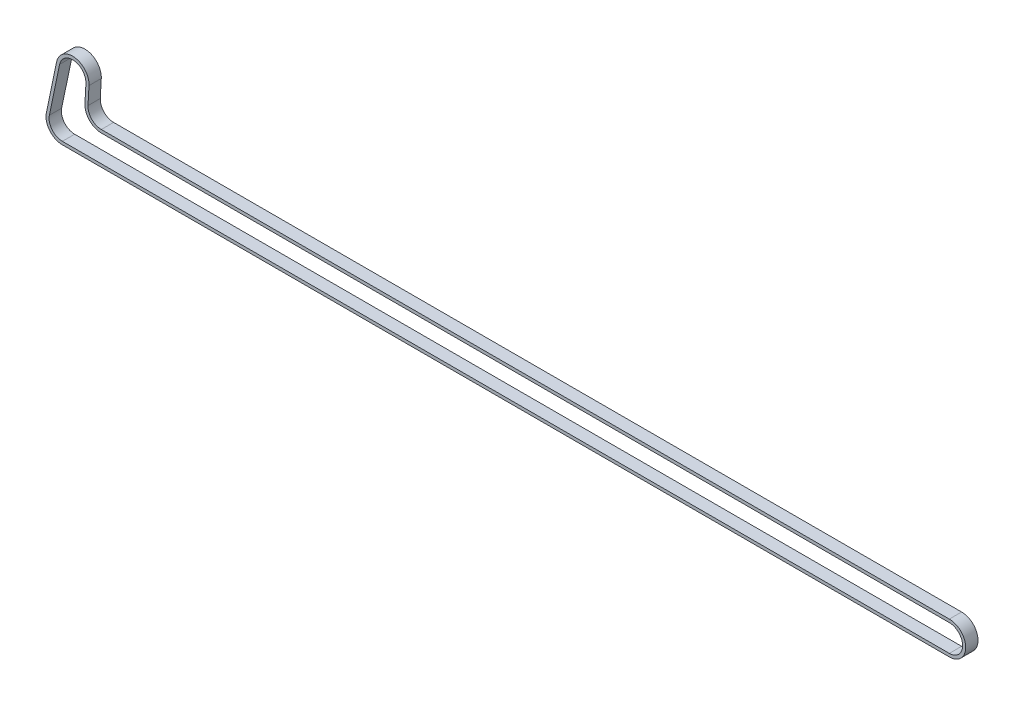
ISO-10303-21;
HEADER;
FILE_DESCRIPTION(('STEP AP214'),'2;1');
FILE_NAME('part.step','',(''),(''),'','','');
FILE_SCHEMA(('AUTOMOTIVE_DESIGN { 1 0 10303 214 1 1 1 1 }'));
ENDSEC;
DATA;
#1=APPLICATION_CONTEXT('core data for automotive mechanical design processes');
#2=APPLICATION_PROTOCOL_DEFINITION('international standard','automotive_design',2000,#1);
#3=PRODUCT_CONTEXT('',#1,'mechanical');
#4=PRODUCT('Part','Part','',(#3));
#5=PRODUCT_RELATED_PRODUCT_CATEGORY('part','',(#4));
#6=PRODUCT_DEFINITION_FORMATION('','',#4);
#7=PRODUCT_DEFINITION_CONTEXT('part definition',#1,'design');
#8=PRODUCT_DEFINITION('design','',#6,#7);
#9=PRODUCT_DEFINITION_SHAPE('','',#8);
#10=(LENGTH_UNIT() NAMED_UNIT(*) SI_UNIT(.MILLI.,.METRE.));
#11=(NAMED_UNIT(*) PLANE_ANGLE_UNIT() SI_UNIT($,.RADIAN.));
#12=(NAMED_UNIT(*) SI_UNIT($,.STERADIAN.) SOLID_ANGLE_UNIT());
#13=UNCERTAINTY_MEASURE_WITH_UNIT(LENGTH_MEASURE(1.E-05),#10,'distance_accuracy_value','');
#14=(GEOMETRIC_REPRESENTATION_CONTEXT(3) GLOBAL_UNCERTAINTY_ASSIGNED_CONTEXT((#13)) GLOBAL_UNIT_ASSIGNED_CONTEXT((#10,
#11,#12)) REPRESENTATION_CONTEXT('',''));
#15=CARTESIAN_POINT('',(0.,0.,0.));
#16=DIRECTION('',(0.,0.,1.));
#17=DIRECTION('',(1.,0.,0.));
#18=AXIS2_PLACEMENT_3D('',#15,#16,#17);
#19=CARTESIAN_POINT('',(-197.5,21.5000000000002,3.));
#20=DIRECTION('',(0.,0.,-1.));
#21=DIRECTION('',(-1.,0.,0.));
#22=AXIS2_PLACEMENT_3D('',#19,#20,#21);
#23=PLANE('',#22);
#24=CARTESIAN_POINT('',(-197.5,21.5000000000002,3.));
#25=DIRECTION('',(0.,0.,-1.));
#26=DIRECTION('',(-1.,0.,0.));
#27=AXIS2_PLACEMENT_3D('',#24,#25,#26);
#28=CIRCLE('',#27,6.50000000000003);
#29=CARTESIAN_POINT('',(-197.5,15.0000000000002,3.));
#30=VERTEX_POINT('',#29);
#31=CARTESIAN_POINT('',(-203.990214915379,21.8565253878626,3.));
#32=VERTEX_POINT('',#31);
#33=EDGE_CURVE('E261',#30,#32,#28,.T.);
#34=ORIENTED_EDGE('',*,*,#33,.T.);
#35=DIRECTION('',(0.0548500596711289,0.998494602366019,0.));
#36=VECTOR('',#35,1.);
#37=CARTESIAN_POINT('',(-203.990214915379,21.8565253878626,3.));
#38=LINE('',#37,#36);
#39=CARTESIAN_POINT('',(-203.512043181072,30.5611995226312,3.));
#40=VERTEX_POINT('',#39);
#41=EDGE_CURVE('E264',#32,#40,#38,.T.);
#42=ORIENTED_EDGE('',*,*,#41,.T.);
#43=CARTESIAN_POINT('',(-211.5,31.0000000000002,3.));
#44=DIRECTION('',(0.,0.,-1.));
#45=DIRECTION('',(-1.,0.,0.));
#46=AXIS2_PLACEMENT_3D('',#43,#44,#45);
#47=CIRCLE('',#46,8.);
#48=CARTESIAN_POINT('',(-219.331843357901,32.6316340328962,3.));
#49=VERTEX_POINT('',#48);
#50=EDGE_CURVE('E267',#40,#49,#47,.F.);
#51=ORIENTED_EDGE('',*,*,#50,.T.);
#52=DIRECTION('',(-0.203954254112001,-0.978980419737605,0.));
#53=VECTOR('',#52,1.);
#54=CARTESIAN_POINT('',(-220.646319231445,26.3221498398846,3.));
#55=LINE('',#54,#53);
#56=CARTESIAN_POINT('',(-224.331843357901,8.6316340328962,3.));
#57=VERTEX_POINT('',#56);
#58=EDGE_CURVE('E269',#49,#57,#55,.T.);
#59=ORIENTED_EDGE('',*,*,#58,.T.);
#60=CARTESIAN_POINT('',(-216.5,7.0000000000002,3.));
#61=DIRECTION('',(0.,0.,-1.));
#62=DIRECTION('',(-1.,0.,0.));
#63=AXIS2_PLACEMENT_3D('',#60,#61,#62);
#64=CIRCLE('',#63,8.0000000000001);
#65=CARTESIAN_POINT('',(-216.5,-0.999999999999898,3.));
#66=VERTEX_POINT('',#65);
#67=EDGE_CURVE('E271',#57,#66,#64,.F.);
#68=ORIENTED_EDGE('',*,*,#67,.T.);
#69=DIRECTION('',(1.,0.,0.));
#70=VECTOR('',#69,1.);
#71=CARTESIAN_POINT('',(-197.5,-1.,3.));
#72=LINE('',#71,#70);
#73=CARTESIAN_POINT('',(216.5,-1.,3.));
#74=VERTEX_POINT('',#73);
#75=EDGE_CURVE('E273',#66,#74,#72,.T.);
#76=ORIENTED_EDGE('',*,*,#75,.T.);
#77=CARTESIAN_POINT('',(216.5,7.0000000000002,3.));
#78=DIRECTION('',(0.,0.,-1.));
#79=DIRECTION('',(-1.,0.,0.));
#80=AXIS2_PLACEMENT_3D('',#77,#78,#79);
#81=CIRCLE('',#80,8.0000000000001);
#82=CARTESIAN_POINT('',(216.5,15.0000000000003,3.));
#83=VERTEX_POINT('',#82);
#84=EDGE_CURVE('E275',#74,#83,#81,.F.);
#85=ORIENTED_EDGE('',*,*,#84,.T.);
#86=DIRECTION('',(-1.,0.,0.));
#87=VECTOR('',#86,1.);
#88=CARTESIAN_POINT('',(-197.5,15.0000000000002,3.));
#89=LINE('',#88,#87);
#90=EDGE_CURVE('E277',#83,#30,#89,.T.);
#91=ORIENTED_EDGE('',*,*,#90,.T.);
#92=EDGE_LOOP('',(#34,#42,#51,#59,#68,#76,#85,#91));
#93=FACE_BOUND('',#92,.T.);
#94=CARTESIAN_POINT('',(-197.5,21.5000000000002,3.));
#95=DIRECTION('',(0.,0.,-1.));
#96=DIRECTION('',(-1.,0.,0.));
#97=AXIS2_PLACEMENT_3D('',#94,#95,#96);
#98=CIRCLE('',#97,8.00000000000004);
#99=CARTESIAN_POINT('',(-197.5,13.5000000000001,3.));
#100=VERTEX_POINT('',#99);
#101=CARTESIAN_POINT('',(-205.487956818928,21.9388004773693,3.));
#102=VERTEX_POINT('',#101);
#103=EDGE_CURVE('E196',#100,#102,#98,.T.);
#104=ORIENTED_EDGE('',*,*,#103,.F.);
#105=DIRECTION('',(-1.,0.,0.));
#106=VECTOR('',#105,1.);
#107=CARTESIAN_POINT('',(-197.5,13.5000000000001,3.));
#108=LINE('',#107,#106);
#109=CARTESIAN_POINT('',(216.5,13.5000000000002,3.));
#110=VERTEX_POINT('',#109);
#111=EDGE_CURVE('E229',#110,#100,#108,.T.);
#112=ORIENTED_EDGE('',*,*,#111,.F.);
#113=CARTESIAN_POINT('',(216.5,7.0000000000002,3.));
#114=DIRECTION('',(0.,0.,-1.));
#115=DIRECTION('',(-1.,0.,0.));
#116=AXIS2_PLACEMENT_3D('',#113,#114,#115);
#117=CIRCLE('',#116,6.5000000000001);
#118=CARTESIAN_POINT('',(216.5,0.5,3.));
#119=VERTEX_POINT('',#118);
#120=EDGE_CURVE('E227',#119,#110,#117,.F.);
#121=ORIENTED_EDGE('',*,*,#120,.F.);
#122=DIRECTION('',(1.,0.,0.));
#123=VECTOR('',#122,1.);
#124=CARTESIAN_POINT('',(-197.5,0.5,3.));
#125=LINE('',#124,#123);
#126=CARTESIAN_POINT('',(-216.5,0.500000000000104,3.));
#127=VERTEX_POINT('',#126);
#128=EDGE_CURVE('E225',#127,#119,#125,.T.);
#129=ORIENTED_EDGE('',*,*,#128,.F.);
#130=CARTESIAN_POINT('',(-216.5,7.0000000000002,3.));
#131=DIRECTION('',(0.,0.,-1.));
#132=DIRECTION('',(-1.,0.,0.));
#133=AXIS2_PLACEMENT_3D('',#130,#131,#132);
#134=CIRCLE('',#133,6.5000000000001);
#135=CARTESIAN_POINT('',(-222.863372728294,8.3257026517282,3.));
#136=VERTEX_POINT('',#135);
#137=EDGE_CURVE('E223',#136,#127,#134,.F.);
#138=ORIENTED_EDGE('',*,*,#137,.F.);
#139=DIRECTION('',(-0.203954254112001,-0.978980419737605,0.));
#140=VECTOR('',#139,1.);
#141=CARTESIAN_POINT('',(-219.177848601838,26.0162184587166,3.));
#142=LINE('',#141,#140);
#143=CARTESIAN_POINT('',(-217.863372728294,32.3257026517282,3.));
#144=VERTEX_POINT('',#143);
#145=EDGE_CURVE('E219',#144,#136,#142,.T.);
#146=ORIENTED_EDGE('',*,*,#145,.F.);
#147=CARTESIAN_POINT('',(-211.5,31.0000000000002,3.));
#148=DIRECTION('',(0.,0.,-1.));
#149=DIRECTION('',(-1.,0.,0.));
#150=AXIS2_PLACEMENT_3D('',#147,#148,#149);
#151=CIRCLE('',#150,6.5);
#152=CARTESIAN_POINT('',(-205.009785084621,30.6434746121379,3.));
#153=VERTEX_POINT('',#152);
#154=EDGE_CURVE('E217',#153,#144,#151,.F.);
#155=ORIENTED_EDGE('',*,*,#154,.F.);
#156=DIRECTION('',(0.0548500596711289,0.998494602366019,0.));
#157=VECTOR('',#156,1.);
#158=CARTESIAN_POINT('',(-205.487956818928,21.9388004773693,3.));
#159=LINE('',#158,#157);
#160=EDGE_CURVE('E204',#102,#153,#159,.T.);
#161=ORIENTED_EDGE('',*,*,#160,.F.);
#162=EDGE_LOOP('',(#104,#112,#121,#129,#138,#146,#155,#161));
#163=FACE_BOUND('',#162,.T.);
#164=ADVANCED_FACE('F83',(#93,#163),#23,.F.);
#165=CARTESIAN_POINT('',(-197.5,21.5000000000002,-3.));
#166=DIRECTION('',(0.,0.,-1.));
#167=DIRECTION('',(-1.,0.,0.));
#168=AXIS2_PLACEMENT_3D('',#165,#166,#167);
#169=PLANE('',#168);
#170=CARTESIAN_POINT('',(-197.5,21.5000000000002,-3.));
#171=DIRECTION('',(0.,0.,-1.));
#172=DIRECTION('',(-1.,0.,0.));
#173=AXIS2_PLACEMENT_3D('',#170,#171,#172);
#174=CIRCLE('',#173,6.50000000000003);
#175=CARTESIAN_POINT('',(-197.5,15.0000000000002,-3.));
#176=VERTEX_POINT('',#175);
#177=CARTESIAN_POINT('',(-203.990214915379,21.8565253878626,-3.));
#178=VERTEX_POINT('',#177);
#179=EDGE_CURVE('E212',#176,#178,#174,.T.);
#180=ORIENTED_EDGE('',*,*,#179,.F.);
#181=DIRECTION('',(-1.,0.,0.));
#182=VECTOR('',#181,1.);
#183=CARTESIAN_POINT('',(-197.5,15.0000000000002,-3.));
#184=LINE('',#183,#182);
#185=CARTESIAN_POINT('',(216.5,15.0000000000003,-3.));
#186=VERTEX_POINT('',#185);
#187=EDGE_CURVE('E265',#186,#176,#184,.T.);
#188=ORIENTED_EDGE('',*,*,#187,.F.);
#189=CARTESIAN_POINT('',(216.5,7.0000000000002,-3.));
#190=DIRECTION('',(0.,0.,-1.));
#191=DIRECTION('',(-1.,0.,0.));
#192=AXIS2_PLACEMENT_3D('',#189,#190,#191);
#193=CIRCLE('',#192,8.0000000000001);
#194=CARTESIAN_POINT('',(216.5,-1.,-3.));
#195=VERTEX_POINT('',#194);
#196=EDGE_CURVE('E292',#195,#186,#193,.F.);
#197=ORIENTED_EDGE('',*,*,#196,.F.);
#198=DIRECTION('',(1.,0.,0.));
#199=VECTOR('',#198,1.);
#200=CARTESIAN_POINT('',(-197.5,-1.,-3.));
#201=LINE('',#200,#199);
#202=CARTESIAN_POINT('',(-216.5,-0.999999999999898,-3.));
#203=VERTEX_POINT('',#202);
#204=EDGE_CURVE('E290',#203,#195,#201,.T.);
#205=ORIENTED_EDGE('',*,*,#204,.F.);
#206=CARTESIAN_POINT('',(-216.5,7.0000000000002,-3.));
#207=DIRECTION('',(0.,0.,-1.));
#208=DIRECTION('',(-1.,0.,0.));
#209=AXIS2_PLACEMENT_3D('',#206,#207,#208);
#210=CIRCLE('',#209,8.0000000000001);
#211=CARTESIAN_POINT('',(-224.331843357901,8.6316340328962,-3.));
#212=VERTEX_POINT('',#211);
#213=EDGE_CURVE('E288',#212,#203,#210,.F.);
#214=ORIENTED_EDGE('',*,*,#213,.F.);
#215=DIRECTION('',(-0.203954254112001,-0.978980419737605,0.));
#216=VECTOR('',#215,1.);
#217=CARTESIAN_POINT('',(-220.646319231445,26.3221498398846,-3.));
#218=LINE('',#217,#216);
#219=CARTESIAN_POINT('',(-219.331843357901,32.6316340328962,-3.));
#220=VERTEX_POINT('',#219);
#221=EDGE_CURVE('E286',#220,#212,#218,.T.);
#222=ORIENTED_EDGE('',*,*,#221,.F.);
#223=CARTESIAN_POINT('',(-211.5,31.0000000000002,-3.));
#224=DIRECTION('',(0.,0.,-1.));
#225=DIRECTION('',(-1.,0.,0.));
#226=AXIS2_PLACEMENT_3D('',#223,#224,#225);
#227=CIRCLE('',#226,8.);
#228=CARTESIAN_POINT('',(-203.512043181072,30.5611995226312,-3.));
#229=VERTEX_POINT('',#228);
#230=EDGE_CURVE('E284',#229,#220,#227,.F.);
#231=ORIENTED_EDGE('',*,*,#230,.F.);
#232=DIRECTION('',(0.0548500596711289,0.998494602366019,0.));
#233=VECTOR('',#232,1.);
#234=CARTESIAN_POINT('',(-203.990214915379,21.8565253878626,-3.));
#235=LINE('',#234,#233);
#236=EDGE_CURVE('E282',#178,#229,#235,.T.);
#237=ORIENTED_EDGE('',*,*,#236,.F.);
#238=EDGE_LOOP('',(#180,#188,#197,#205,#214,#222,#231,#237));
#239=FACE_BOUND('',#238,.T.);
#240=DIRECTION('',(-1.,0.,0.));
#241=VECTOR('',#240,1.);
#242=CARTESIAN_POINT('',(-197.5,13.5000000000001,-3.));
#243=LINE('',#242,#241);
#244=CARTESIAN_POINT('',(216.5,13.5000000000003,-3.));
#245=VERTEX_POINT('',#244);
#246=CARTESIAN_POINT('',(-197.5,13.5000000000001,-3.));
#247=VERTEX_POINT('',#246);
#248=EDGE_CURVE('E205',#245,#247,#243,.T.);
#249=ORIENTED_EDGE('',*,*,#248,.T.);
#250=CARTESIAN_POINT('',(-197.5,21.5000000000002,-3.));
#251=DIRECTION('',(0.,0.,-1.));
#252=DIRECTION('',(-1.,0.,0.));
#253=AXIS2_PLACEMENT_3D('',#250,#251,#252);
#254=CIRCLE('',#253,8.00000000000004);
#255=CARTESIAN_POINT('',(-205.487956818928,21.9388004773693,-3.));
#256=VERTEX_POINT('',#255);
#257=EDGE_CURVE('E106',#247,#256,#254,.T.);
#258=ORIENTED_EDGE('',*,*,#257,.T.);
#259=DIRECTION('',(0.0548500596711289,0.998494602366019,0.));
#260=VECTOR('',#259,1.);
#261=CARTESIAN_POINT('',(-205.487956818928,21.9388004773693,-3.));
#262=LINE('',#261,#260);
#263=CARTESIAN_POINT('',(-205.009785084621,30.6434746121379,-3.));
#264=VERTEX_POINT('',#263);
#265=EDGE_CURVE('E211',#256,#264,#262,.T.);
#266=ORIENTED_EDGE('',*,*,#265,.T.);
#267=CARTESIAN_POINT('',(-211.5,31.0000000000002,-3.));
#268=DIRECTION('',(0.,0.,-1.));
#269=DIRECTION('',(-1.,0.,0.));
#270=AXIS2_PLACEMENT_3D('',#267,#268,#269);
#271=CIRCLE('',#270,6.5);
#272=CARTESIAN_POINT('',(-217.863372728294,32.3257026517282,-3.));
#273=VERTEX_POINT('',#272);
#274=EDGE_CURVE('E233',#264,#273,#271,.F.);
#275=ORIENTED_EDGE('',*,*,#274,.T.);
#276=DIRECTION('',(-0.203954254112001,-0.978980419737605,0.));
#277=VECTOR('',#276,1.);
#278=CARTESIAN_POINT('',(-219.177848601838,26.0162184587166,-3.));
#279=LINE('',#278,#277);
#280=CARTESIAN_POINT('',(-222.863372728294,8.3257026517282,-3.));
#281=VERTEX_POINT('',#280);
#282=EDGE_CURVE('E236',#273,#281,#279,.T.);
#283=ORIENTED_EDGE('',*,*,#282,.T.);
#284=CARTESIAN_POINT('',(-216.5,7.0000000000002,-3.));
#285=DIRECTION('',(0.,0.,-1.));
#286=DIRECTION('',(-1.,0.,0.));
#287=AXIS2_PLACEMENT_3D('',#284,#285,#286);
#288=CIRCLE('',#287,6.5000000000001);
#289=CARTESIAN_POINT('',(-216.5,0.500000000000104,-3.));
#290=VERTEX_POINT('',#289);
#291=EDGE_CURVE('E239',#281,#290,#288,.F.);
#292=ORIENTED_EDGE('',*,*,#291,.T.);
#293=DIRECTION('',(1.,0.,0.));
#294=VECTOR('',#293,1.);
#295=CARTESIAN_POINT('',(-197.5,0.5,-3.));
#296=LINE('',#295,#294);
#297=CARTESIAN_POINT('',(216.5,0.5,-3.));
#298=VERTEX_POINT('',#297);
#299=EDGE_CURVE('E242',#290,#298,#296,.T.);
#300=ORIENTED_EDGE('',*,*,#299,.T.);
#301=CARTESIAN_POINT('',(216.5,7.0000000000002,-3.));
#302=DIRECTION('',(0.,0.,-1.));
#303=DIRECTION('',(-1.,0.,0.));
#304=AXIS2_PLACEMENT_3D('',#301,#302,#303);
#305=CIRCLE('',#304,6.5000000000001);
#306=EDGE_CURVE('E245',#298,#245,#305,.F.);
#307=ORIENTED_EDGE('',*,*,#306,.T.);
#308=EDGE_LOOP('',(#249,#258,#266,#275,#283,#292,#300,#307));
#309=FACE_BOUND('',#308,.T.);
#310=ADVANCED_FACE('F322',(#239,#309),#169,.T.);
#311=CARTESIAN_POINT('',(-197.5,21.5000000000002,3.));
#312=DIRECTION('',(0.,0.,-1.));
#313=DIRECTION('',(-1.,0.,0.));
#314=AXIS2_PLACEMENT_3D('',#311,#312,#313);
#315=CYLINDRICAL_SURFACE('',#314,6.50000000000003);
#316=ORIENTED_EDGE('',*,*,#179,.T.);
#317=DIRECTION('',(0.,0.,-1.));
#318=VECTOR('',#317,1.);
#319=CARTESIAN_POINT('',(-203.990214915379,21.8565253878626,3.));
#320=LINE('',#319,#318);
#321=EDGE_CURVE('E12',#32,#178,#320,.T.);
#322=ORIENTED_EDGE('',*,*,#321,.F.);
#323=ORIENTED_EDGE('',*,*,#33,.F.);
#324=DIRECTION('',(0.,0.,-1.));
#325=VECTOR('',#324,1.);
#326=CARTESIAN_POINT('',(-197.5,15.0000000000002,3.));
#327=LINE('',#326,#325);
#328=EDGE_CURVE('E279',#30,#176,#327,.T.);
#329=ORIENTED_EDGE('',*,*,#328,.T.);
#330=EDGE_LOOP('',(#316,#322,#323,#329));
#331=FACE_BOUND('',#330,.T.);
#332=ADVANCED_FACE('F85',(#331),#315,.F.);
#333=CARTESIAN_POINT('',(-203.990214915379,21.8565253878626,3.));
#334=DIRECTION('',(-0.998494602366019,0.0548500596711289,0.));
#335=DIRECTION('',(-0.0548500596711289,-0.998494602366019,0.));
#336=AXIS2_PLACEMENT_3D('',#333,#334,#335);
#337=PLANE('',#336);
#338=ORIENTED_EDGE('',*,*,#236,.T.);
#339=DIRECTION('',(0.,0.,-1.));
#340=VECTOR('',#339,1.);
#341=CARTESIAN_POINT('',(-203.512043181072,30.5611995226312,3.));
#342=LINE('',#341,#340);
#343=EDGE_CURVE('E91',#40,#229,#342,.T.);
#344=ORIENTED_EDGE('',*,*,#343,.F.);
#345=ORIENTED_EDGE('',*,*,#41,.F.);
#346=ORIENTED_EDGE('',*,*,#321,.T.);
#347=EDGE_LOOP('',(#338,#344,#345,#346));
#348=FACE_BOUND('',#347,.T.);
#349=ADVANCED_FACE('F339',(#348),#337,.F.);
#350=CARTESIAN_POINT('',(-211.5,31.0000000000002,3.));
#351=DIRECTION('',(0.,0.,-1.));
#352=DIRECTION('',(-1.,0.,0.));
#353=AXIS2_PLACEMENT_3D('',#350,#351,#352);
#354=CYLINDRICAL_SURFACE('',#353,8.);
#355=ORIENTED_EDGE('',*,*,#230,.T.);
#356=DIRECTION('',(0.,0.,-1.));
#357=VECTOR('',#356,1.);
#358=CARTESIAN_POINT('',(-219.331843357901,32.6316340328962,3.));
#359=LINE('',#358,#357);
#360=EDGE_CURVE('E309',#49,#220,#359,.T.);
#361=ORIENTED_EDGE('',*,*,#360,.F.);
#362=ORIENTED_EDGE('',*,*,#50,.F.);
#363=ORIENTED_EDGE('',*,*,#343,.T.);
#364=EDGE_LOOP('',(#355,#361,#362,#363));
#365=FACE_BOUND('',#364,.T.);
#366=ADVANCED_FACE('F316',(#365),#354,.T.);
#367=CARTESIAN_POINT('',(-220.646319231445,26.3221498398846,3.));
#368=DIRECTION('',(0.978980419737605,-0.203954254112001,0.));
#369=DIRECTION('',(0.203954254112001,0.978980419737605,0.));
#370=AXIS2_PLACEMENT_3D('',#367,#368,#369);
#371=PLANE('',#370);
#372=ORIENTED_EDGE('',*,*,#221,.T.);
#373=DIRECTION('',(0.,0.,-1.));
#374=VECTOR('',#373,1.);
#375=CARTESIAN_POINT('',(-224.331843357901,8.6316340328962,3.));
#376=LINE('',#375,#374);
#377=EDGE_CURVE('E306',#57,#212,#376,.T.);
#378=ORIENTED_EDGE('',*,*,#377,.F.);
#379=ORIENTED_EDGE('',*,*,#58,.F.);
#380=ORIENTED_EDGE('',*,*,#360,.T.);
#381=EDGE_LOOP('',(#372,#378,#379,#380));
#382=FACE_BOUND('',#381,.T.);
#383=ADVANCED_FACE('F328',(#382),#371,.F.);
#384=CARTESIAN_POINT('',(-216.5,7.0000000000002,3.));
#385=DIRECTION('',(0.,0.,-1.));
#386=DIRECTION('',(-1.,0.,0.));
#387=AXIS2_PLACEMENT_3D('',#384,#385,#386);
#388=CYLINDRICAL_SURFACE('',#387,8.0000000000001);
#389=ORIENTED_EDGE('',*,*,#213,.T.);
#390=DIRECTION('',(0.,0.,-1.));
#391=VECTOR('',#390,1.);
#392=CARTESIAN_POINT('',(-216.5,-0.999999999999898,3.));
#393=LINE('',#392,#391);
#394=EDGE_CURVE('E303',#66,#203,#393,.T.);
#395=ORIENTED_EDGE('',*,*,#394,.F.);
#396=ORIENTED_EDGE('',*,*,#67,.F.);
#397=ORIENTED_EDGE('',*,*,#377,.T.);
#398=EDGE_LOOP('',(#389,#395,#396,#397));
#399=FACE_BOUND('',#398,.T.);
#400=ADVANCED_FACE('F332',(#399),#388,.T.);
#401=CARTESIAN_POINT('',(-197.5,-1.,3.));
#402=DIRECTION('',(0.,1.,0.));
#403=DIRECTION('',(0.,0.,1.));
#404=AXIS2_PLACEMENT_3D('',#401,#402,#403);
#405=PLANE('',#404);
#406=ORIENTED_EDGE('',*,*,#204,.T.);
#407=DIRECTION('',(0.,0.,-1.));
#408=VECTOR('',#407,1.);
#409=CARTESIAN_POINT('',(216.5,-1.,3.));
#410=LINE('',#409,#408);
#411=EDGE_CURVE('E300',#74,#195,#410,.T.);
#412=ORIENTED_EDGE('',*,*,#411,.F.);
#413=ORIENTED_EDGE('',*,*,#75,.F.);
#414=ORIENTED_EDGE('',*,*,#394,.T.);
#415=EDGE_LOOP('',(#406,#412,#413,#414));
#416=FACE_BOUND('',#415,.T.);
#417=ADVANCED_FACE('F352',(#416),#405,.F.);
#418=CARTESIAN_POINT('',(216.5,7.0000000000002,3.));
#419=DIRECTION('',(0.,0.,-1.));
#420=DIRECTION('',(-1.,0.,0.));
#421=AXIS2_PLACEMENT_3D('',#418,#419,#420);
#422=CYLINDRICAL_SURFACE('',#421,8.0000000000001);
#423=ORIENTED_EDGE('',*,*,#196,.T.);
#424=DIRECTION('',(0.,0.,-1.));
#425=VECTOR('',#424,1.);
#426=CARTESIAN_POINT('',(216.5,15.0000000000003,3.));
#427=LINE('',#426,#425);
#428=EDGE_CURVE('E297',#83,#186,#427,.T.);
#429=ORIENTED_EDGE('',*,*,#428,.F.);
#430=ORIENTED_EDGE('',*,*,#84,.F.);
#431=ORIENTED_EDGE('',*,*,#411,.T.);
#432=EDGE_LOOP('',(#423,#429,#430,#431));
#433=FACE_BOUND('',#432,.T.);
#434=ADVANCED_FACE('F350',(#433),#422,.T.);
#435=CARTESIAN_POINT('',(-197.5,15.0000000000002,3.));
#436=DIRECTION('',(0.,-1.,0.));
#437=DIRECTION('',(1.,0.,0.));
#438=AXIS2_PLACEMENT_3D('',#435,#436,#437);
#439=PLANE('',#438);
#440=ORIENTED_EDGE('',*,*,#187,.T.);
#441=ORIENTED_EDGE('',*,*,#328,.F.);
#442=ORIENTED_EDGE('',*,*,#90,.F.);
#443=ORIENTED_EDGE('',*,*,#428,.T.);
#444=EDGE_LOOP('',(#440,#441,#442,#443));
#445=FACE_BOUND('',#444,.T.);
#446=ADVANCED_FACE('F345',(#445),#439,.F.);
#447=CARTESIAN_POINT('',(-197.5,21.5000000000002,3.));
#448=DIRECTION('',(0.,0.,-1.));
#449=DIRECTION('',(-1.,0.,0.));
#450=AXIS2_PLACEMENT_3D('',#447,#448,#449);
#451=CYLINDRICAL_SURFACE('',#450,8.00000000000004);
#452=ORIENTED_EDGE('',*,*,#257,.F.);
#453=DIRECTION('',(0.,0.,-1.));
#454=VECTOR('',#453,1.);
#455=CARTESIAN_POINT('',(-197.5,13.5000000000001,3.));
#456=LINE('',#455,#454);
#457=EDGE_CURVE('E200',#100,#247,#456,.T.);
#458=ORIENTED_EDGE('',*,*,#457,.F.);
#459=ORIENTED_EDGE('',*,*,#103,.T.);
#460=DIRECTION('',(0.,0.,-1.));
#461=VECTOR('',#460,1.);
#462=CARTESIAN_POINT('',(-205.487956818928,21.9388004773693,3.));
#463=LINE('',#462,#461);
#464=EDGE_CURVE('E199',#102,#256,#463,.T.);
#465=ORIENTED_EDGE('',*,*,#464,.T.);
#466=EDGE_LOOP('',(#452,#458,#459,#465));
#467=FACE_BOUND('',#466,.T.);
#468=ADVANCED_FACE('F198',(#467),#451,.T.);
#469=CARTESIAN_POINT('',(-205.487956818928,21.9388004773693,3.));
#470=DIRECTION('',(-0.998494602366019,0.0548500596711289,0.));
#471=DIRECTION('',(-0.0548500596711289,-0.998494602366019,0.));
#472=AXIS2_PLACEMENT_3D('',#469,#470,#471);
#473=PLANE('',#472);
#474=ORIENTED_EDGE('',*,*,#265,.F.);
#475=ORIENTED_EDGE('',*,*,#464,.F.);
#476=ORIENTED_EDGE('',*,*,#160,.T.);
#477=DIRECTION('',(0.,0.,-1.));
#478=VECTOR('',#477,1.);
#479=CARTESIAN_POINT('',(-205.009785084621,30.6434746121379,3.));
#480=LINE('',#479,#478);
#481=EDGE_CURVE('E213',#153,#264,#480,.T.);
#482=ORIENTED_EDGE('',*,*,#481,.T.);
#483=EDGE_LOOP('',(#474,#475,#476,#482));
#484=FACE_BOUND('',#483,.T.);
#485=ADVANCED_FACE('F208',(#484),#473,.T.);
#486=CARTESIAN_POINT('',(-211.5,31.0000000000002,3.));
#487=DIRECTION('',(0.,0.,-1.));
#488=DIRECTION('',(-1.,0.,0.));
#489=AXIS2_PLACEMENT_3D('',#486,#487,#488);
#490=CYLINDRICAL_SURFACE('',#489,6.5);
#491=ORIENTED_EDGE('',*,*,#274,.F.);
#492=ORIENTED_EDGE('',*,*,#481,.F.);
#493=ORIENTED_EDGE('',*,*,#154,.T.);
#494=DIRECTION('',(0.,0.,-1.));
#495=VECTOR('',#494,1.);
#496=CARTESIAN_POINT('',(-217.863372728294,32.3257026517282,3.));
#497=LINE('',#496,#495);
#498=EDGE_CURVE('E258',#144,#273,#497,.T.);
#499=ORIENTED_EDGE('',*,*,#498,.T.);
#500=EDGE_LOOP('',(#491,#492,#493,#499));
#501=FACE_BOUND('',#500,.T.);
#502=ADVANCED_FACE('F377',(#501),#490,.F.);
#503=CARTESIAN_POINT('',(-219.177848601838,26.0162184587166,3.));
#504=DIRECTION('',(0.978980419737605,-0.203954254112001,0.));
#505=DIRECTION('',(0.203954254112001,0.978980419737605,0.));
#506=AXIS2_PLACEMENT_3D('',#503,#504,#505);
#507=PLANE('',#506);
#508=ORIENTED_EDGE('',*,*,#282,.F.);
#509=ORIENTED_EDGE('',*,*,#498,.F.);
#510=ORIENTED_EDGE('',*,*,#145,.T.);
#511=DIRECTION('',(0.,0.,-1.));
#512=VECTOR('',#511,1.);
#513=CARTESIAN_POINT('',(-222.863372728294,8.3257026517282,3.));
#514=LINE('',#513,#512);
#515=EDGE_CURVE('E256',#136,#281,#514,.T.);
#516=ORIENTED_EDGE('',*,*,#515,.T.);
#517=EDGE_LOOP('',(#508,#509,#510,#516));
#518=FACE_BOUND('',#517,.T.);
#519=ADVANCED_FACE('F381',(#518),#507,.T.);
#520=CARTESIAN_POINT('',(-216.5,7.0000000000002,3.));
#521=DIRECTION('',(0.,0.,-1.));
#522=DIRECTION('',(-1.,0.,0.));
#523=AXIS2_PLACEMENT_3D('',#520,#521,#522);
#524=CYLINDRICAL_SURFACE('',#523,6.5000000000001);
#525=ORIENTED_EDGE('',*,*,#291,.F.);
#526=ORIENTED_EDGE('',*,*,#515,.F.);
#527=ORIENTED_EDGE('',*,*,#137,.T.);
#528=DIRECTION('',(0.,0.,-1.));
#529=VECTOR('',#528,1.);
#530=CARTESIAN_POINT('',(-216.5,0.500000000000104,3.));
#531=LINE('',#530,#529);
#532=EDGE_CURVE('E254',#127,#290,#531,.T.);
#533=ORIENTED_EDGE('',*,*,#532,.T.);
#534=EDGE_LOOP('',(#525,#526,#527,#533));
#535=FACE_BOUND('',#534,.T.);
#536=ADVANCED_FACE('F387',(#535),#524,.F.);
#537=CARTESIAN_POINT('',(-197.5,0.5,3.));
#538=DIRECTION('',(0.,1.,0.));
#539=DIRECTION('',(0.,0.,1.));
#540=AXIS2_PLACEMENT_3D('',#537,#538,#539);
#541=PLANE('',#540);
#542=ORIENTED_EDGE('',*,*,#299,.F.);
#543=ORIENTED_EDGE('',*,*,#532,.F.);
#544=ORIENTED_EDGE('',*,*,#128,.T.);
#545=DIRECTION('',(0.,0.,-1.));
#546=VECTOR('',#545,1.);
#547=CARTESIAN_POINT('',(216.5,0.5,3.));
#548=LINE('',#547,#546);
#549=EDGE_CURVE('E252',#119,#298,#548,.T.);
#550=ORIENTED_EDGE('',*,*,#549,.T.);
#551=EDGE_LOOP('',(#542,#543,#544,#550));
#552=FACE_BOUND('',#551,.T.);
#553=ADVANCED_FACE('F391',(#552),#541,.T.);
#554=CARTESIAN_POINT('',(216.5,7.0000000000002,3.));
#555=DIRECTION('',(0.,0.,-1.));
#556=DIRECTION('',(-1.,0.,0.));
#557=AXIS2_PLACEMENT_3D('',#554,#555,#556);
#558=CYLINDRICAL_SURFACE('',#557,6.5000000000001);
#559=ORIENTED_EDGE('',*,*,#306,.F.);
#560=ORIENTED_EDGE('',*,*,#549,.F.);
#561=ORIENTED_EDGE('',*,*,#120,.T.);
#562=DIRECTION('',(0.,0.,-1.));
#563=VECTOR('',#562,1.);
#564=CARTESIAN_POINT('',(216.5,13.5000000000003,3.));
#565=LINE('',#564,#563);
#566=EDGE_CURVE('E98',#110,#245,#565,.T.);
#567=ORIENTED_EDGE('',*,*,#566,.T.);
#568=EDGE_LOOP('',(#559,#560,#561,#567));
#569=FACE_BOUND('',#568,.T.);
#570=ADVANCED_FACE('F395',(#569),#558,.F.);
#571=CARTESIAN_POINT('',(-197.5,13.5000000000001,3.));
#572=DIRECTION('',(0.,-1.,0.));
#573=DIRECTION('',(1.,0.,0.));
#574=AXIS2_PLACEMENT_3D('',#571,#572,#573);
#575=PLANE('',#574);
#576=ORIENTED_EDGE('',*,*,#248,.F.);
#577=ORIENTED_EDGE('',*,*,#566,.F.);
#578=ORIENTED_EDGE('',*,*,#111,.T.);
#579=ORIENTED_EDGE('',*,*,#457,.T.);
#580=EDGE_LOOP('',(#576,#577,#578,#579));
#581=FACE_BOUND('',#580,.T.);
#582=ADVANCED_FACE('F399',(#581),#575,.T.);
#583=CLOSED_SHELL('',(#164,#310,#332,#349,#366,#383,#400,#417,#434,#446,#468,#485,#502,#519,
#536,#553,#570,#582));
#584=MANIFOLD_SOLID_BREP('B2',#583);
#585=ADVANCED_BREP_SHAPE_REPRESENTATION('',(#18,#584),#14);
#586=SHAPE_DEFINITION_REPRESENTATION(#9,#585);
ENDSEC;
END-ISO-10303-21;
